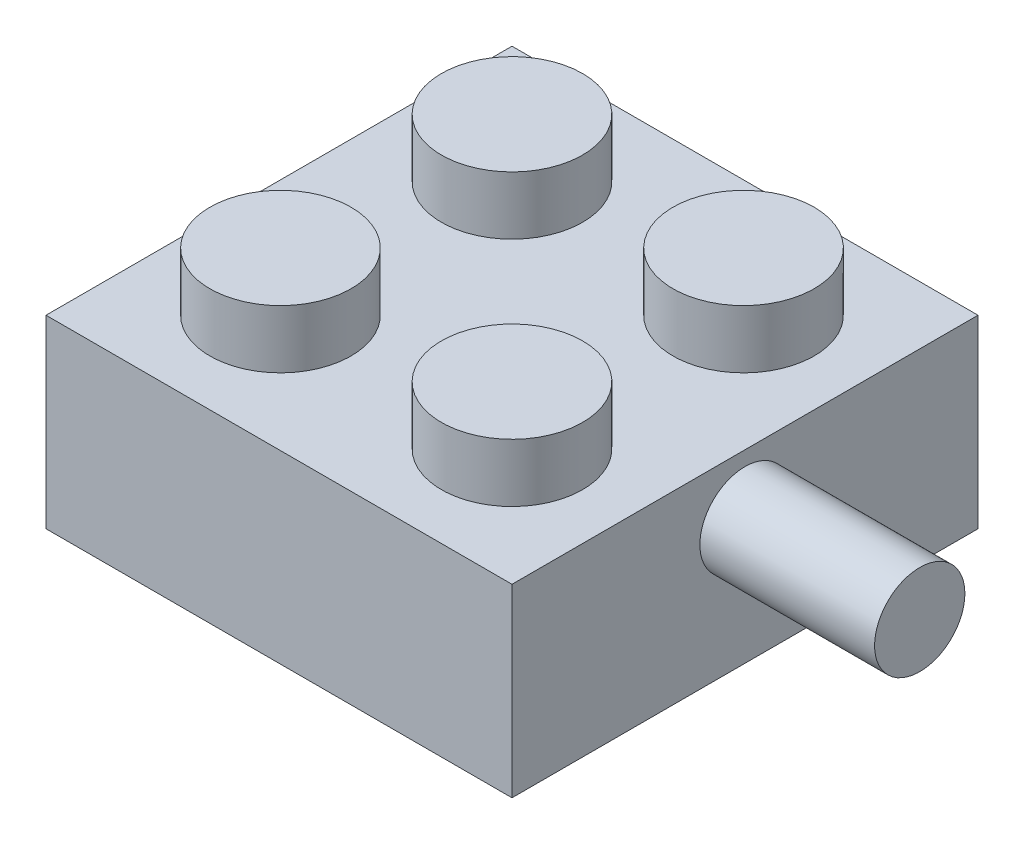
ISO-10303-21;
HEADER;
FILE_DESCRIPTION(('STEP AP214'),'2;1');
FILE_NAME('part.step','',(''),(''),'','','');
FILE_SCHEMA(('AUTOMOTIVE_DESIGN { 1 0 10303 214 1 1 1 1 }'));
ENDSEC;
DATA;
#1=APPLICATION_CONTEXT('core data for automotive mechanical design processes');
#2=APPLICATION_PROTOCOL_DEFINITION('international standard','automotive_design',2000,#1);
#3=PRODUCT_CONTEXT('',#1,'mechanical');
#4=PRODUCT('Part','Part','',(#3));
#5=PRODUCT_RELATED_PRODUCT_CATEGORY('part','',(#4));
#6=PRODUCT_DEFINITION_FORMATION('','',#4);
#7=PRODUCT_DEFINITION_CONTEXT('part definition',#1,'design');
#8=PRODUCT_DEFINITION('design','',#6,#7);
#9=PRODUCT_DEFINITION_SHAPE('','',#8);
#10=(LENGTH_UNIT() NAMED_UNIT(*) SI_UNIT(.MILLI.,.METRE.));
#11=(NAMED_UNIT(*) PLANE_ANGLE_UNIT() SI_UNIT($,.RADIAN.));
#12=(NAMED_UNIT(*) SI_UNIT($,.STERADIAN.) SOLID_ANGLE_UNIT());
#13=UNCERTAINTY_MEASURE_WITH_UNIT(LENGTH_MEASURE(1.E-05),#10,'distance_accuracy_value','');
#14=(GEOMETRIC_REPRESENTATION_CONTEXT(3) GLOBAL_UNCERTAINTY_ASSIGNED_CONTEXT((#13)) GLOBAL_UNIT_ASSIGNED_CONTEXT((#10,
#11,#12)) REPRESENTATION_CONTEXT('',''));
#15=CARTESIAN_POINT('',(0.,0.,0.));
#16=DIRECTION('',(0.,0.,1.));
#17=DIRECTION('',(1.,0.,0.));
#18=AXIS2_PLACEMENT_3D('',#15,#16,#17);
#19=CARTESIAN_POINT('',(-8.,6.35,8.));
#20=DIRECTION('',(-1.,0.,0.));
#21=DIRECTION('',(0.,0.,1.));
#22=AXIS2_PLACEMENT_3D('',#19,#20,#21);
#23=PLANE('',#22);
#24=DIRECTION('',(0.,0.,-1.));
#25=VECTOR('',#24,1.);
#26=CARTESIAN_POINT('',(-8.,0.,8.));
#27=LINE('',#26,#25);
#28=CARTESIAN_POINT('',(-8.,0.,8.));
#29=VERTEX_POINT('',#28);
#30=CARTESIAN_POINT('',(-8.,0.,-8.));
#31=VERTEX_POINT('',#30);
#32=EDGE_CURVE('E111',#29,#31,#27,.T.);
#33=ORIENTED_EDGE('',*,*,#32,.F.);
#34=DIRECTION('',(0.,-1.,0.));
#35=VECTOR('',#34,1.);
#36=CARTESIAN_POINT('',(-8.,6.35,8.));
#37=LINE('',#36,#35);
#38=CARTESIAN_POINT('',(-8.,6.35,8.));
#39=VERTEX_POINT('',#38);
#40=EDGE_CURVE('E52',#39,#29,#37,.T.);
#41=ORIENTED_EDGE('',*,*,#40,.F.);
#42=DIRECTION('',(0.,0.,-1.));
#43=VECTOR('',#42,1.);
#44=CARTESIAN_POINT('',(-8.,6.35,8.));
#45=LINE('',#44,#43);
#46=CARTESIAN_POINT('',(-8.,6.35,-8.));
#47=VERTEX_POINT('',#46);
#48=EDGE_CURVE('E105',#39,#47,#45,.T.);
#49=ORIENTED_EDGE('',*,*,#48,.T.);
#50=DIRECTION('',(0.,-1.,0.));
#51=VECTOR('',#50,1.);
#52=CARTESIAN_POINT('',(-8.,6.35,-8.));
#53=LINE('',#52,#51);
#54=EDGE_CURVE('E46',#47,#31,#53,.T.);
#55=ORIENTED_EDGE('',*,*,#54,.T.);
#56=EDGE_LOOP('',(#33,#41,#49,#55));
#57=FACE_BOUND('',#56,.T.);
#58=ADVANCED_FACE('F43',(#57),#23,.T.);
#59=CARTESIAN_POINT('',(-8.,6.35,8.));
#60=DIRECTION('',(0.,0.,-1.));
#61=DIRECTION('',(-1.,0.,0.));
#62=AXIS2_PLACEMENT_3D('',#59,#60,#61);
#63=PLANE('',#62);
#64=DIRECTION('',(1.,0.,0.));
#65=VECTOR('',#64,1.);
#66=CARTESIAN_POINT('',(-8.,0.,8.));
#67=LINE('',#66,#65);
#68=CARTESIAN_POINT('',(8.,0.,8.));
#69=VERTEX_POINT('',#68);
#70=EDGE_CURVE('E77',#29,#69,#67,.T.);
#71=ORIENTED_EDGE('',*,*,#70,.T.);
#72=DIRECTION('',(0.,-1.,0.));
#73=VECTOR('',#72,1.);
#74=CARTESIAN_POINT('',(8.,6.35,8.));
#75=LINE('',#74,#73);
#76=CARTESIAN_POINT('',(8.,6.35,8.));
#77=VERTEX_POINT('',#76);
#78=EDGE_CURVE('E103',#77,#69,#75,.T.);
#79=ORIENTED_EDGE('',*,*,#78,.F.);
#80=DIRECTION('',(1.,0.,0.));
#81=VECTOR('',#80,1.);
#82=CARTESIAN_POINT('',(-8.,6.35,8.));
#83=LINE('',#82,#81);
#84=EDGE_CURVE('E94',#39,#77,#83,.T.);
#85=ORIENTED_EDGE('',*,*,#84,.F.);
#86=ORIENTED_EDGE('',*,*,#40,.T.);
#87=EDGE_LOOP('',(#71,#79,#85,#86));
#88=FACE_BOUND('',#87,.T.);
#89=ADVANCED_FACE('F123',(#88),#63,.F.);
#90=CARTESIAN_POINT('',(8.,6.35,8.));
#91=DIRECTION('',(-1.,0.,0.));
#92=DIRECTION('',(0.,0.,1.));
#93=AXIS2_PLACEMENT_3D('',#90,#91,#92);
#94=PLANE('',#93);
#95=CARTESIAN_POINT('',(8.,4.3,0.));
#96=DIRECTION('',(1.,0.,0.));
#97=DIRECTION('',(0.,0.,-1.));
#98=AXIS2_PLACEMENT_3D('',#95,#96,#97);
#99=CIRCLE('',#98,1.55);
#100=CARTESIAN_POINT('',(8.,4.3,-1.55));
#101=VERTEX_POINT('',#100);
#102=EDGE_CURVE('E11',#101,#101,#99,.T.);
#103=ORIENTED_EDGE('',*,*,#102,.F.);
#104=EDGE_LOOP('',(#103));
#105=FACE_BOUND('',#104,.T.);
#106=DIRECTION('',(0.,0.,-1.));
#107=VECTOR('',#106,1.);
#108=CARTESIAN_POINT('',(8.,0.,8.));
#109=LINE('',#108,#107);
#110=CARTESIAN_POINT('',(8.,0.,-8.));
#111=VERTEX_POINT('',#110);
#112=EDGE_CURVE('E101',#69,#111,#109,.T.);
#113=ORIENTED_EDGE('',*,*,#112,.T.);
#114=DIRECTION('',(0.,-1.,0.));
#115=VECTOR('',#114,1.);
#116=CARTESIAN_POINT('',(8.,6.35,-8.));
#117=LINE('',#116,#115);
#118=CARTESIAN_POINT('',(8.,6.35,-8.));
#119=VERTEX_POINT('',#118);
#120=EDGE_CURVE('E98',#119,#111,#117,.T.);
#121=ORIENTED_EDGE('',*,*,#120,.F.);
#122=DIRECTION('',(0.,0.,-1.));
#123=VECTOR('',#122,1.);
#124=CARTESIAN_POINT('',(8.,6.35,8.));
#125=LINE('',#124,#123);
#126=EDGE_CURVE('E89',#77,#119,#125,.T.);
#127=ORIENTED_EDGE('',*,*,#126,.F.);
#128=ORIENTED_EDGE('',*,*,#78,.T.);
#129=EDGE_LOOP('',(#113,#121,#127,#128));
#130=FACE_BOUND('',#129,.T.);
#131=ADVANCED_FACE('F99',(#105,#130),#94,.F.);
#132=CARTESIAN_POINT('',(-8.,6.35,-8.));
#133=DIRECTION('',(0.,0.,-1.));
#134=DIRECTION('',(-1.,0.,0.));
#135=AXIS2_PLACEMENT_3D('',#132,#133,#134);
#136=PLANE('',#135);
#137=DIRECTION('',(1.,0.,0.));
#138=VECTOR('',#137,1.);
#139=CARTESIAN_POINT('',(-8.,0.,-8.));
#140=LINE('',#139,#138);
#141=EDGE_CURVE('E114',#31,#111,#140,.T.);
#142=ORIENTED_EDGE('',*,*,#141,.F.);
#143=ORIENTED_EDGE('',*,*,#54,.F.);
#144=DIRECTION('',(1.,0.,0.));
#145=VECTOR('',#144,1.);
#146=CARTESIAN_POINT('',(-8.,6.35,-8.));
#147=LINE('',#146,#145);
#148=EDGE_CURVE('E93',#47,#119,#147,.T.);
#149=ORIENTED_EDGE('',*,*,#148,.T.);
#150=ORIENTED_EDGE('',*,*,#120,.T.);
#151=EDGE_LOOP('',(#142,#143,#149,#150));
#152=FACE_BOUND('',#151,.T.);
#153=ADVANCED_FACE('F104',(#152),#136,.T.);
#154=CARTESIAN_POINT('',(0.,6.35,0.));
#155=DIRECTION('',(0.,-1.,0.));
#156=DIRECTION('',(0.,0.,-1.));
#157=AXIS2_PLACEMENT_3D('',#154,#155,#156);
#158=PLANE('',#157);
#159=CARTESIAN_POINT('',(-3.975,6.35,-3.975));
#160=DIRECTION('',(0.,-1.,0.));
#161=DIRECTION('',(0.,0.,-1.));
#162=AXIS2_PLACEMENT_3D('',#159,#160,#161);
#163=CIRCLE('',#162,2.425);
#164=CARTESIAN_POINT('',(-3.975,6.35,-6.4));
#165=VERTEX_POINT('',#164);
#166=EDGE_CURVE('E190',#165,#165,#163,.T.);
#167=ORIENTED_EDGE('',*,*,#166,.T.);
#168=EDGE_LOOP('',(#167));
#169=FACE_BOUND('',#168,.T.);
#170=CARTESIAN_POINT('',(3.975,6.35,-3.975));
#171=DIRECTION('',(0.,-1.,0.));
#172=DIRECTION('',(0.,0.,-1.));
#173=AXIS2_PLACEMENT_3D('',#170,#171,#172);
#174=CIRCLE('',#173,2.425);
#175=CARTESIAN_POINT('',(3.975,6.35,-6.4));
#176=VERTEX_POINT('',#175);
#177=EDGE_CURVE('E205',#176,#176,#174,.T.);
#178=ORIENTED_EDGE('',*,*,#177,.T.);
#179=EDGE_LOOP('',(#178));
#180=FACE_BOUND('',#179,.T.);
#181=CARTESIAN_POINT('',(3.975,6.35,3.975));
#182=DIRECTION('',(0.,-1.,0.));
#183=DIRECTION('',(0.,0.,-1.));
#184=AXIS2_PLACEMENT_3D('',#181,#182,#183);
#185=CIRCLE('',#184,2.425);
#186=CARTESIAN_POINT('',(3.975,6.35,1.55));
#187=VERTEX_POINT('',#186);
#188=EDGE_CURVE('E199',#187,#187,#185,.T.);
#189=ORIENTED_EDGE('',*,*,#188,.T.);
#190=EDGE_LOOP('',(#189));
#191=FACE_BOUND('',#190,.T.);
#192=CARTESIAN_POINT('',(-3.975,6.35,3.975));
#193=DIRECTION('',(0.,-1.,0.));
#194=DIRECTION('',(0.,0.,-1.));
#195=AXIS2_PLACEMENT_3D('',#192,#193,#194);
#196=CIRCLE('',#195,2.425);
#197=CARTESIAN_POINT('',(-3.975,6.35,1.55));
#198=VERTEX_POINT('',#197);
#199=EDGE_CURVE('E198',#198,#198,#196,.T.);
#200=ORIENTED_EDGE('',*,*,#199,.T.);
#201=EDGE_LOOP('',(#200));
#202=FACE_BOUND('',#201,.T.);
#203=ORIENTED_EDGE('',*,*,#48,.F.);
#204=ORIENTED_EDGE('',*,*,#84,.T.);
#205=ORIENTED_EDGE('',*,*,#126,.T.);
#206=ORIENTED_EDGE('',*,*,#148,.F.);
#207=EDGE_LOOP('',(#203,#204,#205,#206));
#208=FACE_BOUND('',#207,.T.);
#209=ADVANCED_FACE('F92',(#169,#180,#191,#202,#208),#158,.F.);
#210=CARTESIAN_POINT('',(0.,0.,0.));
#211=DIRECTION('',(0.,-1.,0.));
#212=DIRECTION('',(0.,0.,-1.));
#213=AXIS2_PLACEMENT_3D('',#210,#211,#212);
#214=PLANE('',#213);
#215=ORIENTED_EDGE('',*,*,#32,.T.);
#216=ORIENTED_EDGE('',*,*,#141,.T.);
#217=ORIENTED_EDGE('',*,*,#112,.F.);
#218=ORIENTED_EDGE('',*,*,#70,.F.);
#219=EDGE_LOOP('',(#215,#216,#217,#218));
#220=FACE_BOUND('',#219,.T.);
#221=ADVANCED_FACE('F121',(#220),#214,.T.);
#222=CARTESIAN_POINT('',(-3.975,8.35,3.975));
#223=DIRECTION('',(0.,-1.,0.));
#224=DIRECTION('',(0.,0.,-1.));
#225=AXIS2_PLACEMENT_3D('',#222,#223,#224);
#226=CYLINDRICAL_SURFACE('',#225,2.425);
#227=CARTESIAN_POINT('',(-3.975,8.35,3.975));
#228=DIRECTION('',(0.,-1.,0.));
#229=DIRECTION('',(0.,0.,-1.));
#230=AXIS2_PLACEMENT_3D('',#227,#228,#229);
#231=CIRCLE('',#230,2.425);
#232=CARTESIAN_POINT('',(-3.975,8.35,1.55));
#233=VERTEX_POINT('',#232);
#234=EDGE_CURVE('E115',#233,#233,#231,.T.);
#235=ORIENTED_EDGE('',*,*,#234,.T.);
#236=EDGE_LOOP('',(#235));
#237=FACE_BOUND('',#236,.T.);
#238=ORIENTED_EDGE('',*,*,#199,.F.);
#239=EDGE_LOOP('',(#238));
#240=FACE_BOUND('',#239,.T.);
#241=ADVANCED_FACE('F144',(#237,#240),#226,.T.);
#242=CARTESIAN_POINT('',(-3.975,8.35,3.975));
#243=DIRECTION('',(0.,-1.,0.));
#244=DIRECTION('',(0.,0.,-1.));
#245=AXIS2_PLACEMENT_3D('',#242,#243,#244);
#246=PLANE('',#245);
#247=ORIENTED_EDGE('',*,*,#234,.F.);
#248=EDGE_LOOP('',(#247));
#249=FACE_BOUND('',#248,.T.);
#250=ADVANCED_FACE('F149',(#249),#246,.F.);
#251=CARTESIAN_POINT('',(3.975,8.35,3.975));
#252=DIRECTION('',(0.,-1.,0.));
#253=DIRECTION('',(0.,0.,-1.));
#254=AXIS2_PLACEMENT_3D('',#251,#252,#253);
#255=CYLINDRICAL_SURFACE('',#254,2.425);
#256=CARTESIAN_POINT('',(3.975,8.35,3.975));
#257=DIRECTION('',(0.,-1.,0.));
#258=DIRECTION('',(0.,0.,-1.));
#259=AXIS2_PLACEMENT_3D('',#256,#257,#258);
#260=CIRCLE('',#259,2.425);
#261=CARTESIAN_POINT('',(3.975,8.35,1.55));
#262=VERTEX_POINT('',#261);
#263=EDGE_CURVE('E195',#262,#262,#260,.T.);
#264=ORIENTED_EDGE('',*,*,#263,.T.);
#265=EDGE_LOOP('',(#264));
#266=FACE_BOUND('',#265,.T.);
#267=ORIENTED_EDGE('',*,*,#188,.F.);
#268=EDGE_LOOP('',(#267));
#269=FACE_BOUND('',#268,.T.);
#270=ADVANCED_FACE('F153',(#266,#269),#255,.T.);
#271=CARTESIAN_POINT('',(3.975,8.35,3.975));
#272=DIRECTION('',(0.,-1.,0.));
#273=DIRECTION('',(0.,0.,-1.));
#274=AXIS2_PLACEMENT_3D('',#271,#272,#273);
#275=PLANE('',#274);
#276=ORIENTED_EDGE('',*,*,#263,.F.);
#277=EDGE_LOOP('',(#276));
#278=FACE_BOUND('',#277,.T.);
#279=ADVANCED_FACE('F168',(#278),#275,.F.);
#280=CARTESIAN_POINT('',(3.975,8.35,-3.975));
#281=DIRECTION('',(0.,-1.,0.));
#282=DIRECTION('',(0.,0.,-1.));
#283=AXIS2_PLACEMENT_3D('',#280,#281,#282);
#284=CYLINDRICAL_SURFACE('',#283,2.425);
#285=CARTESIAN_POINT('',(3.975,8.35,-3.975));
#286=DIRECTION('',(0.,-1.,0.));
#287=DIRECTION('',(0.,0.,-1.));
#288=AXIS2_PLACEMENT_3D('',#285,#286,#287);
#289=CIRCLE('',#288,2.425);
#290=CARTESIAN_POINT('',(3.975,8.35,-6.4));
#291=VERTEX_POINT('',#290);
#292=EDGE_CURVE('E202',#291,#291,#289,.T.);
#293=ORIENTED_EDGE('',*,*,#292,.T.);
#294=EDGE_LOOP('',(#293));
#295=FACE_BOUND('',#294,.T.);
#296=ORIENTED_EDGE('',*,*,#177,.F.);
#297=EDGE_LOOP('',(#296));
#298=FACE_BOUND('',#297,.T.);
#299=ADVANCED_FACE('F165',(#295,#298),#284,.T.);
#300=CARTESIAN_POINT('',(3.975,8.35,-3.975));
#301=DIRECTION('',(0.,-1.,0.));
#302=DIRECTION('',(0.,0.,-1.));
#303=AXIS2_PLACEMENT_3D('',#300,#301,#302);
#304=PLANE('',#303);
#305=ORIENTED_EDGE('',*,*,#292,.F.);
#306=EDGE_LOOP('',(#305));
#307=FACE_BOUND('',#306,.T.);
#308=ADVANCED_FACE('F159',(#307),#304,.F.);
#309=CARTESIAN_POINT('',(-3.975,8.35,-3.975));
#310=DIRECTION('',(0.,-1.,0.));
#311=DIRECTION('',(0.,0.,-1.));
#312=AXIS2_PLACEMENT_3D('',#309,#310,#311);
#313=CYLINDRICAL_SURFACE('',#312,2.425);
#314=CARTESIAN_POINT('',(-3.975,8.35,-3.975));
#315=DIRECTION('',(0.,-1.,0.));
#316=DIRECTION('',(0.,0.,-1.));
#317=AXIS2_PLACEMENT_3D('',#314,#315,#316);
#318=CIRCLE('',#317,2.425);
#319=CARTESIAN_POINT('',(-3.975,8.35,-6.4));
#320=VERTEX_POINT('',#319);
#321=EDGE_CURVE('E192',#320,#320,#318,.T.);
#322=ORIENTED_EDGE('',*,*,#321,.T.);
#323=EDGE_LOOP('',(#322));
#324=FACE_BOUND('',#323,.T.);
#325=ORIENTED_EDGE('',*,*,#166,.F.);
#326=EDGE_LOOP('',(#325));
#327=FACE_BOUND('',#326,.T.);
#328=ADVANCED_FACE('F155',(#324,#327),#313,.T.);
#329=CARTESIAN_POINT('',(-3.975,8.35,-3.975));
#330=DIRECTION('',(0.,-1.,0.));
#331=DIRECTION('',(0.,0.,-1.));
#332=AXIS2_PLACEMENT_3D('',#329,#330,#331);
#333=PLANE('',#332);
#334=ORIENTED_EDGE('',*,*,#321,.F.);
#335=EDGE_LOOP('',(#334));
#336=FACE_BOUND('',#335,.T.);
#337=ADVANCED_FACE('F158',(#336),#333,.F.);
#338=CARTESIAN_POINT('',(14.,4.3,0.));
#339=DIRECTION('',(-1.,0.,0.));
#340=DIRECTION('',(0.,0.,1.));
#341=AXIS2_PLACEMENT_3D('',#338,#339,#340);
#342=CYLINDRICAL_SURFACE('',#341,1.55);
#343=CARTESIAN_POINT('',(14.,4.3,0.));
#344=DIRECTION('',(1.,0.,0.));
#345=DIRECTION('',(0.,0.,-1.));
#346=AXIS2_PLACEMENT_3D('',#343,#344,#345);
#347=CIRCLE('',#346,1.55);
#348=CARTESIAN_POINT('',(14.,4.3,-1.55));
#349=VERTEX_POINT('',#348);
#350=EDGE_CURVE('E189',#349,#349,#347,.T.);
#351=ORIENTED_EDGE('',*,*,#350,.F.);
#352=EDGE_LOOP('',(#351));
#353=FACE_BOUND('',#352,.T.);
#354=ORIENTED_EDGE('',*,*,#102,.T.);
#355=EDGE_LOOP('',(#354));
#356=FACE_BOUND('',#355,.T.);
#357=ADVANCED_FACE('F163',(#353,#356),#342,.T.);
#358=CARTESIAN_POINT('',(14.,4.3,0.));
#359=DIRECTION('',(1.,0.,0.));
#360=DIRECTION('',(0.,0.,-1.));
#361=AXIS2_PLACEMENT_3D('',#358,#359,#360);
#362=PLANE('',#361);
#363=ORIENTED_EDGE('',*,*,#350,.T.);
#364=EDGE_LOOP('',(#363));
#365=FACE_BOUND('',#364,.T.);
#366=ADVANCED_FACE('F181',(#365),#362,.T.);
#367=CLOSED_SHELL('',(#58,#89,#131,#153,#209,#221,#241,#250,#270,#279,#299,#308,#328,#337,#357,#366));
#368=MANIFOLD_SOLID_BREP('B2',#367);
#369=ADVANCED_BREP_SHAPE_REPRESENTATION('',(#18,#368),#14);
#370=SHAPE_DEFINITION_REPRESENTATION(#9,#369);
ENDSEC;
END-ISO-10303-21;
